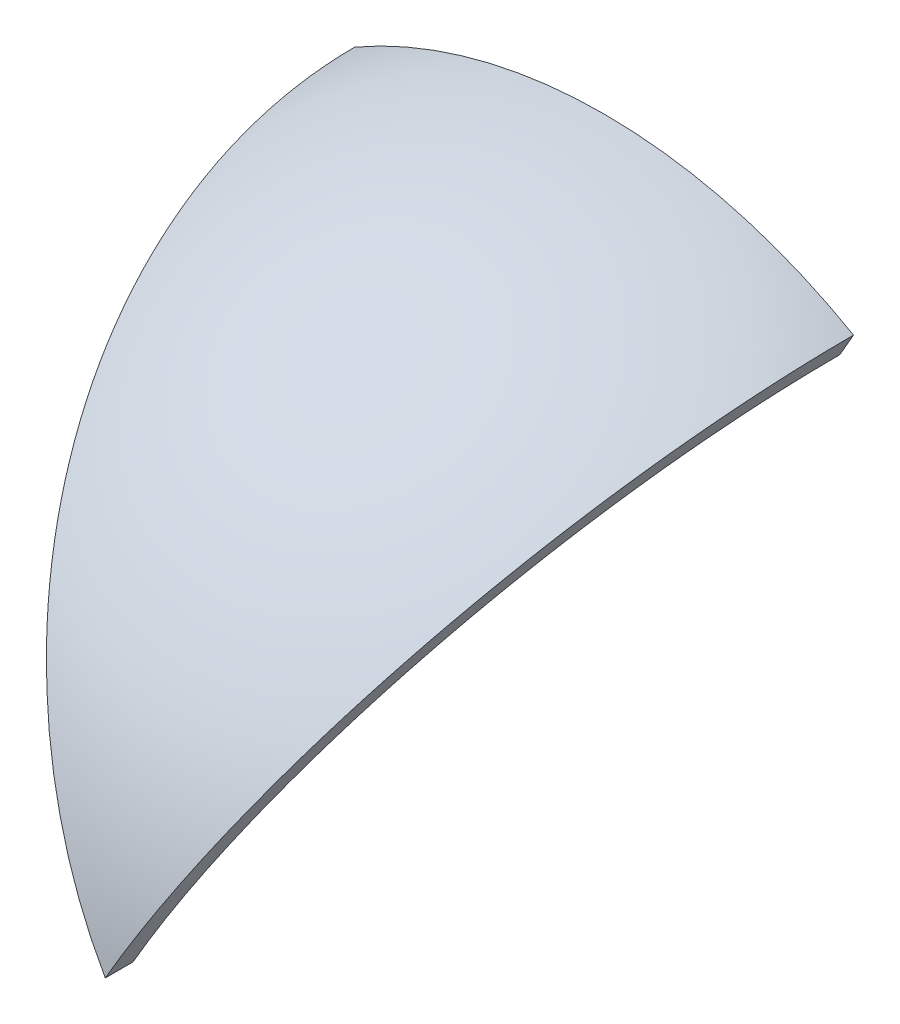
ISO-10303-21;
HEADER;
FILE_DESCRIPTION(('STEP AP214'),'2;1');
FILE_NAME('part.step','',(''),(''),'','','');
FILE_SCHEMA(('AUTOMOTIVE_DESIGN { 1 0 10303 214 1 1 1 1 }'));
ENDSEC;
DATA;
#1=APPLICATION_CONTEXT('core data for automotive mechanical design processes');
#2=APPLICATION_PROTOCOL_DEFINITION('international standard','automotive_design',2000,#1);
#3=PRODUCT_CONTEXT('',#1,'mechanical');
#4=PRODUCT('Part','Part','',(#3));
#5=PRODUCT_RELATED_PRODUCT_CATEGORY('part','',(#4));
#6=PRODUCT_DEFINITION_FORMATION('','',#4);
#7=PRODUCT_DEFINITION_CONTEXT('part definition',#1,'design');
#8=PRODUCT_DEFINITION('design','',#6,#7);
#9=PRODUCT_DEFINITION_SHAPE('','',#8);
#10=(LENGTH_UNIT() NAMED_UNIT(*) SI_UNIT(.MILLI.,.METRE.));
#11=(NAMED_UNIT(*) PLANE_ANGLE_UNIT() SI_UNIT($,.RADIAN.));
#12=(NAMED_UNIT(*) SI_UNIT($,.STERADIAN.) SOLID_ANGLE_UNIT());
#13=UNCERTAINTY_MEASURE_WITH_UNIT(LENGTH_MEASURE(1.E-05),#10,'distance_accuracy_value','');
#14=(GEOMETRIC_REPRESENTATION_CONTEXT(3) GLOBAL_UNCERTAINTY_ASSIGNED_CONTEXT((#13)) GLOBAL_UNIT_ASSIGNED_CONTEXT((#10,
#11,#12)) REPRESENTATION_CONTEXT('',''));
#15=CARTESIAN_POINT('',(0.,0.,0.));
#16=DIRECTION('',(0.,0.,1.));
#17=DIRECTION('',(1.,0.,0.));
#18=AXIS2_PLACEMENT_3D('',#15,#16,#17);
#19=CARTESIAN_POINT('',(0.,0.,0.));
#20=DIRECTION('',(0.,0.,1.));
#21=DIRECTION('',(1.,0.,0.));
#22=AXIS2_PLACEMENT_3D('',#19,#20,#21);
#23=PLANE('',#22);
#24=CARTESIAN_POINT('',(0.,0.,0.));
#25=DIRECTION('',(0.,0.,1.));
#26=DIRECTION('',(1.,0.,0.));
#27=AXIS2_PLACEMENT_3D('',#24,#25,#26);
#28=CIRCLE('',#27,180.);
#29=CARTESIAN_POINT('',(-90.0000000000002,155.884572681199,0.));
#30=VERTEX_POINT('',#29);
#31=CARTESIAN_POINT('',(90.0000000000002,155.884572681199,0.));
#32=VERTEX_POINT('',#31);
#33=EDGE_CURVE('E57',#30,#32,#28,.F.);
#34=ORIENTED_EDGE('',*,*,#33,.T.);
#35=DIRECTION('',(-0.500000000000001,-0.866025403784438,0.));
#36=VECTOR('',#35,1.);
#37=CARTESIAN_POINT('',(0.,0.,0.));
#38=LINE('',#37,#36);
#39=CARTESIAN_POINT('',(85.0000000000002,147.224318643355,0.));
#40=VERTEX_POINT('',#39);
#41=EDGE_CURVE('E75',#32,#40,#38,.T.);
#42=ORIENTED_EDGE('',*,*,#41,.T.);
#43=CARTESIAN_POINT('',(0.,0.,0.));
#44=DIRECTION('',(0.,0.,1.));
#45=DIRECTION('',(1.,0.,0.));
#46=AXIS2_PLACEMENT_3D('',#43,#44,#45);
#47=CIRCLE('',#46,170.);
#48=CARTESIAN_POINT('',(-85.0000000000002,147.224318643354,0.));
#49=VERTEX_POINT('',#48);
#50=EDGE_CURVE('E50',#40,#49,#47,.T.);
#51=ORIENTED_EDGE('',*,*,#50,.T.);
#52=DIRECTION('',(0.500000000000001,-0.866025403784438,0.));
#53=VECTOR('',#52,1.);
#54=CARTESIAN_POINT('',(0.,0.,0.));
#55=LINE('',#54,#53);
#56=EDGE_CURVE('E43',#30,#49,#55,.T.);
#57=ORIENTED_EDGE('',*,*,#56,.F.);
#58=EDGE_LOOP('',(#34,#42,#51,#57));
#59=FACE_BOUND('',#58,.T.);
#60=ADVANCED_FACE('F35',(#59),#23,.F.);
#61=CARTESIAN_POINT('',(0.,0.,0.));
#62=DIRECTION('',(-0.866025403784438,0.500000000000001,0.));
#63=DIRECTION('',(-0.500000000000001,-0.866025403784438,0.));
#64=AXIS2_PLACEMENT_3D('',#61,#62,#63);
#65=PLANE('',#64);
#66=CARTESIAN_POINT('',(0.,0.,0.));
#67=DIRECTION('',(-0.866025403784438,0.500000000000001,0.));
#68=DIRECTION('',(-0.500000000000001,-0.866025403784438,0.));
#69=AXIS2_PLACEMENT_3D('',#66,#67,#68);
#70=CIRCLE('',#69,180.);
#71=CARTESIAN_POINT('',(0.,0.,180.));
#72=VERTEX_POINT('',#71);
#73=EDGE_CURVE('E77',#32,#72,#70,.F.);
#74=ORIENTED_EDGE('',*,*,#73,.T.);
#75=DIRECTION('',(0.,0.,1.));
#76=VECTOR('',#75,1.);
#77=CARTESIAN_POINT('',(0.,0.,0.));
#78=LINE('',#77,#76);
#79=CARTESIAN_POINT('',(0.,0.,170.));
#80=VERTEX_POINT('',#79);
#81=EDGE_CURVE('E11',#80,#72,#78,.T.);
#82=ORIENTED_EDGE('',*,*,#81,.F.);
#83=CARTESIAN_POINT('',(0.,0.,0.));
#84=DIRECTION('',(-0.866025403784438,0.500000000000001,0.));
#85=DIRECTION('',(-0.500000000000001,-0.866025403784438,0.));
#86=AXIS2_PLACEMENT_3D('',#83,#84,#85);
#87=CIRCLE('',#86,170.);
#88=EDGE_CURVE('E78',#80,#40,#87,.T.);
#89=ORIENTED_EDGE('',*,*,#88,.T.);
#90=ORIENTED_EDGE('',*,*,#41,.F.);
#91=EDGE_LOOP('',(#74,#82,#89,#90));
#92=FACE_BOUND('',#91,.T.);
#93=ADVANCED_FACE('F90',(#92),#65,.F.);
#94=CARTESIAN_POINT('',(0.,0.,0.));
#95=DIRECTION('',(-0.866025403784438,-0.500000000000001,0.));
#96=DIRECTION('',(0.500000000000001,-0.866025403784438,0.));
#97=AXIS2_PLACEMENT_3D('',#94,#95,#96);
#98=PLANE('',#97);
#99=CARTESIAN_POINT('',(0.,0.,0.));
#100=DIRECTION('',(-0.866025403784438,-0.500000000000001,0.));
#101=DIRECTION('',(0.500000000000001,-0.866025403784438,0.));
#102=AXIS2_PLACEMENT_3D('',#99,#100,#101);
#103=CIRCLE('',#102,180.);
#104=EDGE_CURVE('E73',#30,#72,#103,.F.);
#105=ORIENTED_EDGE('',*,*,#104,.F.);
#106=ORIENTED_EDGE('',*,*,#56,.T.);
#107=CARTESIAN_POINT('',(0.,0.,0.));
#108=DIRECTION('',(-0.866025403784438,-0.500000000000001,0.));
#109=DIRECTION('',(0.500000000000001,-0.866025403784438,0.));
#110=AXIS2_PLACEMENT_3D('',#107,#108,#109);
#111=CIRCLE('',#110,170.);
#112=EDGE_CURVE('E71',#80,#49,#111,.T.);
#113=ORIENTED_EDGE('',*,*,#112,.F.);
#114=ORIENTED_EDGE('',*,*,#81,.T.);
#115=EDGE_LOOP('',(#105,#106,#113,#114));
#116=FACE_BOUND('',#115,.T.);
#117=ADVANCED_FACE('F70',(#116),#98,.T.);
#118=CARTESIAN_POINT('',(0.,0.,0.));
#119=DIRECTION('',(0.,1.,0.));
#120=DIRECTION('',(1.,0.,0.));
#121=AXIS2_PLACEMENT_3D('',#118,#119,#120);
#122=SPHERICAL_SURFACE('',#121,170.);
#123=ORIENTED_EDGE('',*,*,#88,.F.);
#124=ORIENTED_EDGE('',*,*,#112,.T.);
#125=ORIENTED_EDGE('',*,*,#50,.F.);
#126=EDGE_LOOP('',(#123,#124,#125));
#127=FACE_BOUND('',#126,.T.);
#128=ADVANCED_FACE('F80',(#127),#122,.F.);
#129=CARTESIAN_POINT('',(0.,0.,0.));
#130=DIRECTION('',(0.,1.,0.));
#131=DIRECTION('',(1.,0.,0.));
#132=AXIS2_PLACEMENT_3D('',#129,#130,#131);
#133=SPHERICAL_SURFACE('',#132,180.);
#134=ORIENTED_EDGE('',*,*,#33,.F.);
#135=ORIENTED_EDGE('',*,*,#104,.T.);
#136=ORIENTED_EDGE('',*,*,#73,.F.);
#137=EDGE_LOOP('',(#134,#135,#136));
#138=FACE_BOUND('',#137,.T.);
#139=ADVANCED_FACE('F37',(#138),#133,.T.);
#140=CLOSED_SHELL('',(#60,#93,#117,#128,#139));
#141=MANIFOLD_SOLID_BREP('B2',#140);
#142=ADVANCED_BREP_SHAPE_REPRESENTATION('',(#18,#141),#14);
#143=SHAPE_DEFINITION_REPRESENTATION(#9,#142);
ENDSEC;
END-ISO-10303-21;
